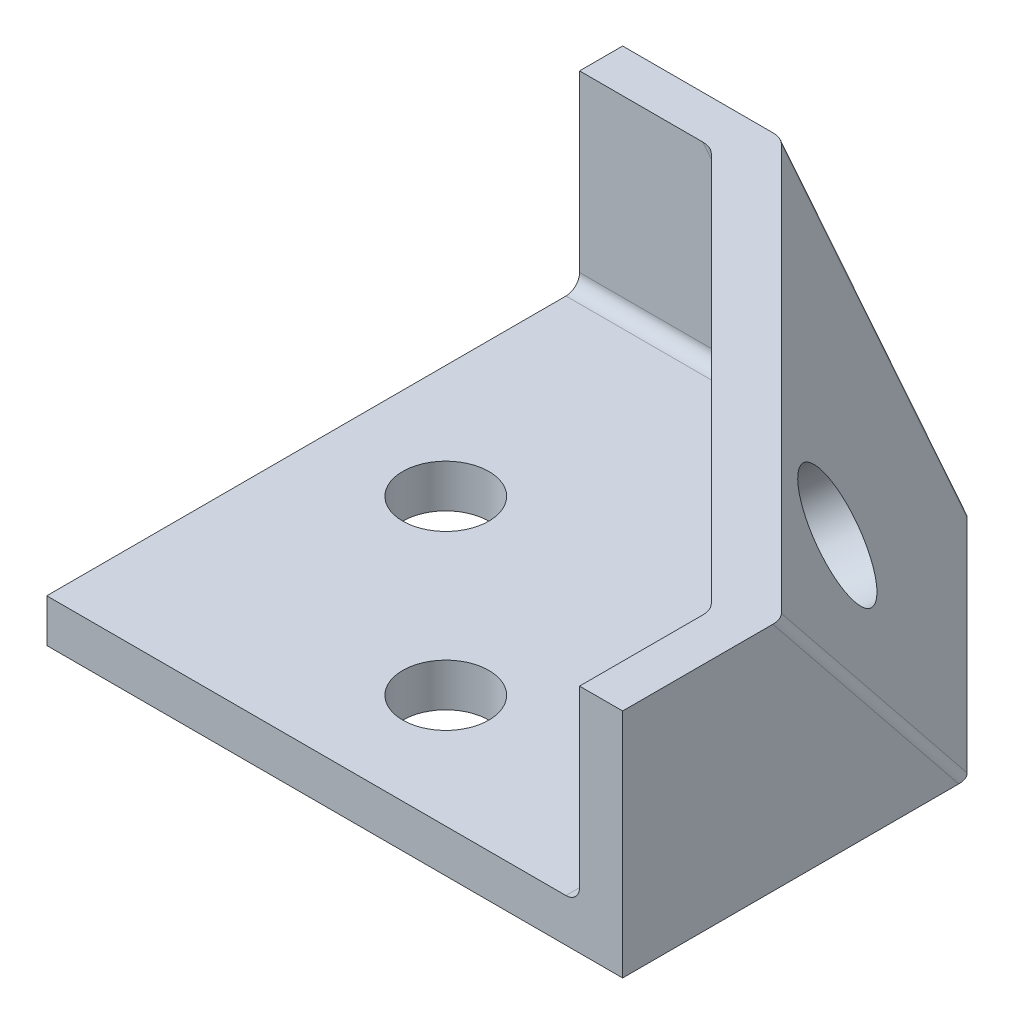
ISO-10303-21;
HEADER;
FILE_DESCRIPTION(('STEP AP214'),'2;1');
FILE_NAME('part.step','',(''),(''),'','','');
FILE_SCHEMA(('AUTOMOTIVE_DESIGN { 1 0 10303 214 1 1 1 1 }'));
ENDSEC;
DATA;
#1=APPLICATION_CONTEXT('core data for automotive mechanical design processes');
#2=APPLICATION_PROTOCOL_DEFINITION('international standard','automotive_design',2000,#1);
#3=PRODUCT_CONTEXT('',#1,'mechanical');
#4=PRODUCT('Part','Part','',(#3));
#5=PRODUCT_RELATED_PRODUCT_CATEGORY('part','',(#4));
#6=PRODUCT_DEFINITION_FORMATION('','',#4);
#7=PRODUCT_DEFINITION_CONTEXT('part definition',#1,'design');
#8=PRODUCT_DEFINITION('design','',#6,#7);
#9=PRODUCT_DEFINITION_SHAPE('','',#8);
#10=(LENGTH_UNIT() NAMED_UNIT(*) SI_UNIT(.MILLI.,.METRE.));
#11=(NAMED_UNIT(*) PLANE_ANGLE_UNIT() SI_UNIT($,.RADIAN.));
#12=(NAMED_UNIT(*) SI_UNIT($,.STERADIAN.) SOLID_ANGLE_UNIT());
#13=UNCERTAINTY_MEASURE_WITH_UNIT(LENGTH_MEASURE(1.E-05),#10,'distance_accuracy_value','');
#14=(GEOMETRIC_REPRESENTATION_CONTEXT(3) GLOBAL_UNCERTAINTY_ASSIGNED_CONTEXT((#13)) GLOBAL_UNIT_ASSIGNED_CONTEXT((#10,
#11,#12)) REPRESENTATION_CONTEXT('',''));
#15=CARTESIAN_POINT('',(0.,0.,0.));
#16=DIRECTION('',(0.,0.,1.));
#17=DIRECTION('',(1.,0.,0.));
#18=AXIS2_PLACEMENT_3D('',#15,#16,#17);
#19=CARTESIAN_POINT('',(-63.5,51.,-63.5));
#20=DIRECTION('',(1.,0.,0.));
#21=DIRECTION('',(0.,0.,-1.));
#22=AXIS2_PLACEMENT_3D('',#19,#20,#21);
#23=PLANE('',#22);
#24=DIRECTION('',(0.,0.,1.));
#25=VECTOR('',#24,1.);
#26=CARTESIAN_POINT('',(-63.5,9.5,-63.5));
#27=LINE('',#26,#25);
#28=CARTESIAN_POINT('',(-63.5,9.5,-51.));
#29=VERTEX_POINT('',#28);
#30=CARTESIAN_POINT('',(-63.5,9.5,63.5));
#31=VERTEX_POINT('',#30);
#32=EDGE_CURVE('E313',#29,#31,#27,.T.);
#33=ORIENTED_EDGE('',*,*,#32,.F.);
#34=CARTESIAN_POINT('',(-63.5,12.5,-51.));
#35=DIRECTION('',(1.,0.,0.));
#36=DIRECTION('',(0.,0.,-1.));
#37=AXIS2_PLACEMENT_3D('',#34,#35,#36);
#38=CIRCLE('',#37,3.);
#39=CARTESIAN_POINT('',(-63.5,12.5,-54.));
#40=VERTEX_POINT('',#39);
#41=EDGE_CURVE('E191',#29,#40,#38,.T.);
#42=ORIENTED_EDGE('',*,*,#41,.T.);
#43=DIRECTION('',(0.,-1.,0.));
#44=VECTOR('',#43,1.);
#45=CARTESIAN_POINT('',(-63.5,51.,-54.));
#46=LINE('',#45,#44);
#47=CARTESIAN_POINT('',(-63.5,51.,-54.));
#48=VERTEX_POINT('',#47);
#49=EDGE_CURVE('E176',#48,#40,#46,.T.);
#50=ORIENTED_EDGE('',*,*,#49,.F.);
#51=DIRECTION('',(0.,0.,1.));
#52=VECTOR('',#51,1.);
#53=CARTESIAN_POINT('',(-63.5,51.,-63.5));
#54=LINE('',#53,#52);
#55=CARTESIAN_POINT('',(-63.5,51.,-63.5));
#56=VERTEX_POINT('',#55);
#57=EDGE_CURVE('E189',#56,#48,#54,.T.);
#58=ORIENTED_EDGE('',*,*,#57,.F.);
#59=DIRECTION('',(0.,-1.,0.));
#60=VECTOR('',#59,1.);
#61=CARTESIAN_POINT('',(-63.5,51.,-63.5));
#62=LINE('',#61,#60);
#63=CARTESIAN_POINT('',(-63.5,0.,-63.5));
#64=VERTEX_POINT('',#63);
#65=EDGE_CURVE('E212',#56,#64,#62,.T.);
#66=ORIENTED_EDGE('',*,*,#65,.T.);
#67=DIRECTION('',(0.,0.,1.));
#68=VECTOR('',#67,1.);
#69=CARTESIAN_POINT('',(-63.5,0.,-63.5));
#70=LINE('',#69,#68);
#71=CARTESIAN_POINT('',(-63.5,0.,63.5));
#72=VERTEX_POINT('',#71);
#73=EDGE_CURVE('E213',#64,#72,#70,.T.);
#74=ORIENTED_EDGE('',*,*,#73,.T.);
#75=DIRECTION('',(0.,-1.,0.));
#76=VECTOR('',#75,1.);
#77=CARTESIAN_POINT('',(-63.5,51.,63.5));
#78=LINE('',#77,#76);
#79=EDGE_CURVE('E223',#31,#72,#78,.T.);
#80=ORIENTED_EDGE('',*,*,#79,.F.);
#81=EDGE_LOOP('',(#33,#42,#50,#58,#66,#74,#80));
#82=FACE_BOUND('',#81,.T.);
#83=ADVANCED_FACE('F62',(#82),#23,.F.);
#84=CARTESIAN_POINT('',(-63.5,51.,63.5));
#85=DIRECTION('',(0.,0.,-1.));
#86=DIRECTION('',(-1.,0.,0.));
#87=AXIS2_PLACEMENT_3D('',#84,#85,#86);
#88=PLANE('',#87);
#89=DIRECTION('',(1.,0.,0.));
#90=VECTOR('',#89,1.);
#91=CARTESIAN_POINT('',(-63.5,9.5,63.5));
#92=LINE('',#91,#90);
#93=CARTESIAN_POINT('',(51.,9.5,63.5));
#94=VERTEX_POINT('',#93);
#95=EDGE_CURVE('E311',#31,#94,#92,.T.);
#96=ORIENTED_EDGE('',*,*,#95,.F.);
#97=ORIENTED_EDGE('',*,*,#79,.T.);
#98=DIRECTION('',(1.,0.,0.));
#99=VECTOR('',#98,1.);
#100=CARTESIAN_POINT('',(-63.5,0.,63.5));
#101=LINE('',#100,#99);
#102=CARTESIAN_POINT('',(63.5,0.,63.5));
#103=VERTEX_POINT('',#102);
#104=EDGE_CURVE('E216',#72,#103,#101,.T.);
#105=ORIENTED_EDGE('',*,*,#104,.T.);
#106=DIRECTION('',(0.,-1.,0.));
#107=VECTOR('',#106,1.);
#108=CARTESIAN_POINT('',(63.5,51.,63.5));
#109=LINE('',#108,#107);
#110=CARTESIAN_POINT('',(63.5,51.,63.5));
#111=VERTEX_POINT('',#110);
#112=EDGE_CURVE('E220',#111,#103,#109,.T.);
#113=ORIENTED_EDGE('',*,*,#112,.F.);
#114=DIRECTION('',(1.,0.,0.));
#115=VECTOR('',#114,1.);
#116=CARTESIAN_POINT('',(-63.5,51.,63.5));
#117=LINE('',#116,#115);
#118=CARTESIAN_POINT('',(54.,51.,63.5));
#119=VERTEX_POINT('',#118);
#120=EDGE_CURVE('E198',#119,#111,#117,.T.);
#121=ORIENTED_EDGE('',*,*,#120,.F.);
#122=DIRECTION('',(0.,-1.,0.));
#123=VECTOR('',#122,1.);
#124=CARTESIAN_POINT('',(54.,51.,63.5));
#125=LINE('',#124,#123);
#126=CARTESIAN_POINT('',(54.,12.5,63.5));
#127=VERTEX_POINT('',#126);
#128=EDGE_CURVE('E192',#119,#127,#125,.T.);
#129=ORIENTED_EDGE('',*,*,#128,.T.);
#130=CARTESIAN_POINT('',(51.,12.5,63.5));
#131=DIRECTION('',(0.,0.,-1.));
#132=DIRECTION('',(-1.,0.,0.));
#133=AXIS2_PLACEMENT_3D('',#130,#131,#132);
#134=CIRCLE('',#133,3.);
#135=EDGE_CURVE('E238',#127,#94,#134,.T.);
#136=ORIENTED_EDGE('',*,*,#135,.T.);
#137=EDGE_LOOP('',(#96,#97,#105,#113,#121,#129,#136));
#138=FACE_BOUND('',#137,.T.);
#139=ADVANCED_FACE('F335',(#138),#88,.F.);
#140=CARTESIAN_POINT('',(63.5,51.,-63.5));
#141=DIRECTION('',(-1.,0.,0.));
#142=DIRECTION('',(0.,0.,1.));
#143=AXIS2_PLACEMENT_3D('',#140,#141,#142);
#144=PLANE('',#143);
#145=DIRECTION('',(0.,0.,-1.));
#146=VECTOR('',#145,1.);
#147=CARTESIAN_POINT('',(63.5,0.,-63.5));
#148=LINE('',#147,#146);
#149=CARTESIAN_POINT('',(63.5,0.,-10.6197736736357));
#150=VERTEX_POINT('',#149);
#151=EDGE_CURVE('E203',#103,#150,#148,.T.);
#152=ORIENTED_EDGE('',*,*,#151,.T.);
#153=DIRECTION('',(0.,-0.779375670806284,-0.62655691182466));
#154=VECTOR('',#153,1.);
#155=CARTESIAN_POINT('',(63.5,50.0818418382933,29.642099176757));
#156=LINE('',#155,#154);
#157=CARTESIAN_POINT('',(63.5,51.,30.3802263263643));
#158=VERTEX_POINT('',#157);
#159=EDGE_CURVE('E270',#150,#158,#156,.F.);
#160=ORIENTED_EDGE('',*,*,#159,.T.);
#161=DIRECTION('',(0.,0.,-1.));
#162=VECTOR('',#161,1.);
#163=CARTESIAN_POINT('',(63.5,51.,-63.5));
#164=LINE('',#163,#162);
#165=EDGE_CURVE('E201',#111,#158,#164,.T.);
#166=ORIENTED_EDGE('',*,*,#165,.F.);
#167=ORIENTED_EDGE('',*,*,#112,.T.);
#168=EDGE_LOOP('',(#152,#160,#166,#167));
#169=FACE_BOUND('',#168,.T.);
#170=ADVANCED_FACE('F331',(#169),#144,.F.);
#171=CARTESIAN_POINT('',(-63.5,51.,-63.5));
#172=DIRECTION('',(0.,0.,1.));
#173=DIRECTION('',(1.,0.,0.));
#174=AXIS2_PLACEMENT_3D('',#171,#172,#173);
#175=PLANE('',#174);
#176=DIRECTION('',(-1.,0.,0.));
#177=VECTOR('',#176,1.);
#178=CARTESIAN_POINT('',(-63.5,51.,-63.5));
#179=LINE('',#178,#177);
#180=CARTESIAN_POINT('',(-30.3802263263644,51.,-63.5));
#181=VERTEX_POINT('',#180);
#182=EDGE_CURVE('E196',#181,#56,#179,.T.);
#183=ORIENTED_EDGE('',*,*,#182,.F.);
#184=DIRECTION('',(-0.62655691182466,0.779375670806284,0.));
#185=VECTOR('',#184,1.);
#186=CARTESIAN_POINT('',(11.3579008232429,-0.918158161706656,-63.5));
#187=LINE('',#186,#185);
#188=CARTESIAN_POINT('',(10.6197736736356,0.,-63.5));
#189=VERTEX_POINT('',#188);
#190=EDGE_CURVE('E87',#181,#189,#187,.F.);
#191=ORIENTED_EDGE('',*,*,#190,.T.);
#192=DIRECTION('',(-1.,0.,0.));
#193=VECTOR('',#192,1.);
#194=CARTESIAN_POINT('',(-63.5,0.,-63.5));
#195=LINE('',#194,#193);
#196=EDGE_CURVE('E199',#189,#64,#195,.T.);
#197=ORIENTED_EDGE('',*,*,#196,.T.);
#198=ORIENTED_EDGE('',*,*,#65,.F.);
#199=EDGE_LOOP('',(#183,#191,#197,#198));
#200=FACE_BOUND('',#199,.T.);
#201=ADVANCED_FACE('F340',(#200),#175,.F.);
#202=CARTESIAN_POINT('',(-63.5,51.,63.5));
#203=DIRECTION('',(0.,1.,0.));
#204=DIRECTION('',(0.,0.,1.));
#205=AXIS2_PLACEMENT_3D('',#202,#203,#204);
#206=PLANE('',#205);
#207=DIRECTION('',(-0.707106781186548,0.,-0.707106781186547));
#208=VECTOR('',#207,1.);
#209=CARTESIAN_POINT('',(17.5,51.,-17.5));
#210=LINE('',#209,#208);
#211=CARTESIAN_POINT('',(62.3441767652003,51.,27.3441767652003));
#212=VERTEX_POINT('',#211);
#213=CARTESIAN_POINT('',(-27.3441767652003,51.,-62.3441767652003));
#214=VERTEX_POINT('',#213);
#215=EDGE_CURVE('E206',#212,#214,#210,.T.);
#216=ORIENTED_EDGE('',*,*,#215,.T.);
#217=CARTESIAN_POINT('',(-30.3802263263644,51.,-60.5));
#218=DIRECTION('',(0.,1.,0.));
#219=DIRECTION('',(1.,0.,0.));
#220=AXIS2_PLACEMENT_3D('',#217,#218,#219);
#221=ELLIPSE('',#220,3.84923485858421,3.);
#222=EDGE_CURVE('E264',#214,#181,#221,.T.);
#223=ORIENTED_EDGE('',*,*,#222,.T.);
#224=ORIENTED_EDGE('',*,*,#182,.T.);
#225=ORIENTED_EDGE('',*,*,#57,.T.);
#226=DIRECTION('',(-1.,0.,0.));
#227=VECTOR('',#226,1.);
#228=CARTESIAN_POINT('',(-63.5,51.,-54.));
#229=LINE('',#228,#227);
#230=CARTESIAN_POINT('',(-36.3342763598515,51.,-54.));
#231=VERTEX_POINT('',#230);
#232=EDGE_CURVE('E172',#231,#48,#229,.T.);
#233=ORIENTED_EDGE('',*,*,#232,.F.);
#234=CARTESIAN_POINT('',(-36.3342763598515,51.,-51.));
#235=DIRECTION('',(0.,1.,0.));
#236=DIRECTION('',(-1.,0.,0.));
#237=AXIS2_PLACEMENT_3D('',#234,#235,#236);
#238=ELLIPSE('',#237,3.84923485858421,3.);
#239=CARTESIAN_POINT('',(-33.2982267986875,51.,-52.8441767652003));
#240=VERTEX_POINT('',#239);
#241=EDGE_CURVE('E44',#231,#240,#238,.F.);
#242=ORIENTED_EDGE('',*,*,#241,.T.);
#243=DIRECTION('',(-0.707106781186548,0.,-0.707106781186547));
#244=VECTOR('',#243,1.);
#245=CARTESIAN_POINT('',(9.77297498325641,51.,-9.77297498325644));
#246=LINE('',#245,#244);
#247=CARTESIAN_POINT('',(52.8441767652003,51.,33.2982267986874));
#248=VERTEX_POINT('',#247);
#249=EDGE_CURVE('E308',#248,#240,#246,.T.);
#250=ORIENTED_EDGE('',*,*,#249,.F.);
#251=CARTESIAN_POINT('',(51.,51.,36.3342763598515));
#252=DIRECTION('',(0.,1.,0.));
#253=DIRECTION('',(0.,0.,-1.));
#254=AXIS2_PLACEMENT_3D('',#251,#252,#253);
#255=ELLIPSE('',#254,3.84923485858421,3.);
#256=CARTESIAN_POINT('',(54.,51.,36.3342763598515));
#257=VERTEX_POINT('',#256);
#258=EDGE_CURVE('E71',#248,#257,#255,.F.);
#259=ORIENTED_EDGE('',*,*,#258,.T.);
#260=DIRECTION('',(0.,0.,-1.));
#261=VECTOR('',#260,1.);
#262=CARTESIAN_POINT('',(54.,51.,-63.5));
#263=LINE('',#262,#261);
#264=EDGE_CURVE('E183',#119,#257,#263,.T.);
#265=ORIENTED_EDGE('',*,*,#264,.F.);
#266=ORIENTED_EDGE('',*,*,#120,.T.);
#267=ORIENTED_EDGE('',*,*,#165,.T.);
#268=CARTESIAN_POINT('',(60.5,51.,30.3802263263643));
#269=DIRECTION('',(0.,1.,0.));
#270=DIRECTION('',(0.,0.,1.));
#271=AXIS2_PLACEMENT_3D('',#268,#269,#270);
#272=ELLIPSE('',#271,3.84923485858421,3.);
#273=EDGE_CURVE('E262',#158,#212,#272,.T.);
#274=ORIENTED_EDGE('',*,*,#273,.T.);
#275=EDGE_LOOP('',(#216,#223,#224,#225,#233,#242,#250,#259,#265,#266,#267,#274));
#276=FACE_BOUND('',#275,.T.);
#277=ADVANCED_FACE('F195',(#276),#206,.T.);
#278=CARTESIAN_POINT('',(-63.5,0.,63.5));
#279=DIRECTION('',(0.,1.,0.));
#280=DIRECTION('',(0.,0.,1.));
#281=AXIS2_PLACEMENT_3D('',#278,#279,#280);
#282=PLANE('',#281);
#283=CARTESIAN_POINT('',(-0.50000000000001,0.,38.5));
#284=DIRECTION('',(0.,1.,0.));
#285=DIRECTION('',(0.,0.,1.));
#286=AXIS2_PLACEMENT_3D('',#283,#284,#285);
#287=CIRCLE('',#286,9.5);
#288=CARTESIAN_POINT('',(-0.50000000000001,0.,48.));
#289=VERTEX_POINT('',#288);
#290=EDGE_CURVE('E289',#289,#289,#287,.T.);
#291=ORIENTED_EDGE('',*,*,#290,.T.);
#292=EDGE_LOOP('',(#291));
#293=FACE_BOUND('',#292,.T.);
#294=CARTESIAN_POINT('',(-38.5,0.,0.5));
#295=DIRECTION('',(0.,1.,0.));
#296=DIRECTION('',(0.,0.,1.));
#297=AXIS2_PLACEMENT_3D('',#294,#295,#296);
#298=CIRCLE('',#297,9.5);
#299=CARTESIAN_POINT('',(-38.5,0.,10.));
#300=VERTEX_POINT('',#299);
#301=EDGE_CURVE('E297',#300,#300,#298,.T.);
#302=ORIENTED_EDGE('',*,*,#301,.T.);
#303=EDGE_LOOP('',(#302));
#304=FACE_BOUND('',#303,.T.);
#305=ORIENTED_EDGE('',*,*,#196,.F.);
#306=CARTESIAN_POINT('',(10.6197736736356,0.,-60.5));
#307=DIRECTION('',(0.,1.,0.));
#308=DIRECTION('',(1.,0.,0.));
#309=AXIS2_PLACEMENT_3D('',#306,#307,#308);
#310=ELLIPSE('',#309,3.84923485858421,3.);
#311=CARTESIAN_POINT('',(13.6558232347997,0.,-62.3441767652003));
#312=VERTEX_POINT('',#311);
#313=EDGE_CURVE('E268',#189,#312,#310,.F.);
#314=ORIENTED_EDGE('',*,*,#313,.T.);
#315=DIRECTION('',(-0.707106781186548,0.,-0.707106781186547));
#316=VECTOR('',#315,1.);
#317=CARTESIAN_POINT('',(38.,0.,-38.));
#318=LINE('',#317,#316);
#319=CARTESIAN_POINT('',(62.3441767652003,0.,-13.6558232347997));
#320=VERTEX_POINT('',#319);
#321=EDGE_CURVE('E225',#320,#312,#318,.T.);
#322=ORIENTED_EDGE('',*,*,#321,.F.);
#323=CARTESIAN_POINT('',(60.5,0.,-10.6197736736357));
#324=DIRECTION('',(0.,1.,0.));
#325=DIRECTION('',(0.,0.,1.));
#326=AXIS2_PLACEMENT_3D('',#323,#324,#325);
#327=ELLIPSE('',#326,3.84923485858421,3.);
#328=EDGE_CURVE('E79',#320,#150,#327,.F.);
#329=ORIENTED_EDGE('',*,*,#328,.T.);
#330=ORIENTED_EDGE('',*,*,#151,.F.);
#331=ORIENTED_EDGE('',*,*,#104,.F.);
#332=ORIENTED_EDGE('',*,*,#73,.F.);
#333=EDGE_LOOP('',(#305,#314,#322,#329,#330,#331,#332));
#334=FACE_BOUND('',#333,.T.);
#335=ADVANCED_FACE('F337',(#293,#304,#334),#282,.F.);
#336=CARTESIAN_POINT('',(28.7194537265727,23.0881882899898,-28.7194537265727));
#337=DIRECTION('',(0.614725588400102,0.494191159302043,-0.614725588400102));
#338=DIRECTION('',(-0.707106781186548,0.,-0.707106781186547));
#339=AXIS2_PLACEMENT_3D('',#336,#337,#338);
#340=PLANE('',#339);
#341=CARTESIAN_POINT('',(38.2602862577775,35.6434838343814,-9.08514830673944));
#342=DIRECTION('',(0.614725588400102,0.494191159302043,-0.614725588400102));
#343=DIRECTION('',(-0.707106781186548,0.,-0.707106781186547));
#344=AXIS2_PLACEMENT_3D('',#341,#342,#343);
#345=CIRCLE('',#344,12.5);
#346=CARTESIAN_POINT('',(29.4214514929456,35.6434838343814,-17.9239830715713));
#347=VERTEX_POINT('',#346);
#348=EDGE_CURVE('E300',#347,#347,#345,.T.);
#349=ORIENTED_EDGE('',*,*,#348,.F.);
#350=EDGE_LOOP('',(#349));
#351=FACE_BOUND('',#350,.T.);
#352=ORIENTED_EDGE('',*,*,#321,.T.);
#353=DIRECTION('',(-0.62655691182466,0.779375670806284,0.));
#354=VECTOR('',#353,1.);
#355=CARTESIAN_POINT('',(-27.7979224115567,51.5644153161995,-62.3441767652003));
#356=LINE('',#355,#354);
#357=EDGE_CURVE('E259',#312,#214,#356,.T.);
#358=ORIENTED_EDGE('',*,*,#357,.T.);
#359=ORIENTED_EDGE('',*,*,#215,.F.);
#360=DIRECTION('',(0.,-0.779375670806284,-0.62655691182466));
#361=VECTOR('',#360,1.);
#362=CARTESIAN_POINT('',(62.3441767652003,0.56441531619948,-13.2020775884433));
#363=LINE('',#362,#361);
#364=EDGE_CURVE('E256',#212,#320,#363,.T.);
#365=ORIENTED_EDGE('',*,*,#364,.T.);
#366=EDGE_LOOP('',(#352,#358,#359,#365));
#367=FACE_BOUND('',#366,.T.);
#368=ADVANCED_FACE('F325',(#351,#367),#340,.T.);
#369=CARTESIAN_POINT('',(54.,51.,-63.5));
#370=DIRECTION('',(-1.,0.,0.));
#371=DIRECTION('',(0.,0.,1.));
#372=AXIS2_PLACEMENT_3D('',#369,#370,#371);
#373=PLANE('',#372);
#374=ORIENTED_EDGE('',*,*,#264,.T.);
#375=DIRECTION('',(0.,-0.779375670806284,-0.62655691182466));
#376=VECTOR('',#375,1.);
#377=CARTESIAN_POINT('',(54.,2.24860535533641,-2.85802129566238));
#378=LINE('',#377,#376);
#379=CARTESIAN_POINT('',(54.,12.5,5.38329596769462));
#380=VERTEX_POINT('',#379);
#381=EDGE_CURVE('E240',#257,#380,#378,.T.);
#382=ORIENTED_EDGE('',*,*,#381,.T.);
#383=DIRECTION('',(0.,0.,-1.));
#384=VECTOR('',#383,1.);
#385=CARTESIAN_POINT('',(54.,12.5,63.5));
#386=LINE('',#385,#384);
#387=EDGE_CURVE('E235',#380,#127,#386,.F.);
#388=ORIENTED_EDGE('',*,*,#387,.T.);
#389=ORIENTED_EDGE('',*,*,#128,.F.);
#390=EDGE_LOOP('',(#374,#382,#388,#389));
#391=FACE_BOUND('',#390,.T.);
#392=ADVANCED_FACE('F397',(#391),#373,.T.);
#393=CARTESIAN_POINT('',(-63.5,51.,-54.));
#394=DIRECTION('',(0.,0.,1.));
#395=DIRECTION('',(1.,0.,0.));
#396=AXIS2_PLACEMENT_3D('',#393,#394,#395);
#397=PLANE('',#396);
#398=DIRECTION('',(-1.,0.,0.));
#399=VECTOR('',#398,1.);
#400=CARTESIAN_POINT('',(-1.09130493544793,12.5,-54.));
#401=LINE('',#400,#399);
#402=CARTESIAN_POINT('',(-5.38329596769465,12.5,-54.));
#403=VERTEX_POINT('',#402);
#404=EDGE_CURVE('E233',#40,#403,#401,.F.);
#405=ORIENTED_EDGE('',*,*,#404,.T.);
#406=DIRECTION('',(-0.62655691182466,0.779375670806284,0.));
#407=VECTOR('',#406,1.);
#408=CARTESIAN_POINT('',(-46.998821301255,64.265653463697,-54.));
#409=LINE('',#408,#407);
#410=EDGE_CURVE('E179',#403,#231,#409,.T.);
#411=ORIENTED_EDGE('',*,*,#410,.T.);
#412=ORIENTED_EDGE('',*,*,#232,.T.);
#413=ORIENTED_EDGE('',*,*,#49,.T.);
#414=EDGE_LOOP('',(#405,#411,#412,#413));
#415=FACE_BOUND('',#414,.T.);
#416=ADVANCED_FACE('F175',(#415),#397,.T.);
#417=CARTESIAN_POINT('',(-63.5,9.5,63.5));
#418=DIRECTION('',(0.,1.,0.));
#419=DIRECTION('',(0.,0.,1.));
#420=AXIS2_PLACEMENT_3D('',#417,#418,#419);
#421=PLANE('',#420);
#422=CARTESIAN_POINT('',(-0.50000000000001,9.5,38.5));
#423=DIRECTION('',(0.,1.,0.));
#424=DIRECTION('',(0.,0.,1.));
#425=AXIS2_PLACEMENT_3D('',#422,#423,#424);
#426=CIRCLE('',#425,9.5);
#427=CARTESIAN_POINT('',(-0.50000000000001,9.5,48.));
#428=VERTEX_POINT('',#427);
#429=EDGE_CURVE('E284',#428,#428,#426,.T.);
#430=ORIENTED_EDGE('',*,*,#429,.F.);
#431=EDGE_LOOP('',(#430));
#432=FACE_BOUND('',#431,.T.);
#433=CARTESIAN_POINT('',(-38.5,9.5,0.5));
#434=DIRECTION('',(0.,1.,0.));
#435=DIRECTION('',(0.,0.,1.));
#436=AXIS2_PLACEMENT_3D('',#433,#434,#435);
#437=CIRCLE('',#436,9.5);
#438=CARTESIAN_POINT('',(-38.5,9.5,10.));
#439=VERTEX_POINT('',#438);
#440=EDGE_CURVE('E294',#439,#439,#437,.T.);
#441=ORIENTED_EDGE('',*,*,#440,.F.);
#442=EDGE_LOOP('',(#441));
#443=FACE_BOUND('',#442,.T.);
#444=DIRECTION('',(0.,0.,-1.));
#445=VECTOR('',#444,1.);
#446=CARTESIAN_POINT('',(51.,9.5,1.09130493544791));
#447=LINE('',#446,#445);
#448=CARTESIAN_POINT('',(51.,9.5,5.38329596769462));
#449=VERTEX_POINT('',#448);
#450=EDGE_CURVE('E228',#94,#449,#447,.T.);
#451=ORIENTED_EDGE('',*,*,#450,.T.);
#452=DIRECTION('',(-0.707106781186548,0.,-0.707106781186547));
#453=VECTOR('',#452,1.);
#454=CARTESIAN_POINT('',(22.8083520161527,9.5,-22.8083520161527));
#455=LINE('',#454,#453);
#456=CARTESIAN_POINT('',(-5.38329596769464,9.5,-51.));
#457=VERTEX_POINT('',#456);
#458=EDGE_CURVE('E251',#449,#457,#455,.T.);
#459=ORIENTED_EDGE('',*,*,#458,.T.);
#460=DIRECTION('',(-1.,0.,0.));
#461=VECTOR('',#460,1.);
#462=CARTESIAN_POINT('',(-63.5,9.5,-51.));
#463=LINE('',#462,#461);
#464=EDGE_CURVE('E231',#457,#29,#463,.T.);
#465=ORIENTED_EDGE('',*,*,#464,.T.);
#466=ORIENTED_EDGE('',*,*,#32,.T.);
#467=ORIENTED_EDGE('',*,*,#95,.T.);
#468=EDGE_LOOP('',(#451,#459,#465,#466,#467));
#469=FACE_BOUND('',#468,.T.);
#470=ADVANCED_FACE('F399',(#432,#443,#469),#421,.T.);
#471=CARTESIAN_POINT('',(22.8795606367717,18.3933722766204,-22.8795606367717));
#472=DIRECTION('',(0.614725588400102,0.494191159302043,-0.614725588400102));
#473=DIRECTION('',(-0.707106781186548,0.,-0.707106781186547));
#474=AXIS2_PLACEMENT_3D('',#471,#472,#473);
#475=PLANE('',#474);
#476=CARTESIAN_POINT('',(32.4203931679765,30.948667821012,-3.24525521693847));
#477=DIRECTION('',(0.614725588400102,0.494191159302043,-0.614725588400102));
#478=DIRECTION('',(-0.707106781186548,0.,-0.707106781186547));
#479=AXIS2_PLACEMENT_3D('',#476,#477,#478);
#480=CIRCLE('',#479,12.5);
#481=CARTESIAN_POINT('',(23.5815584031447,30.948667821012,-12.0840899817703));
#482=VERTEX_POINT('',#481);
#483=EDGE_CURVE('E305',#482,#482,#480,.F.);
#484=ORIENTED_EDGE('',*,*,#483,.F.);
#485=EDGE_LOOP('',(#484));
#486=FACE_BOUND('',#485,.T.);
#487=DIRECTION('',(-0.707106781186548,0.,-0.707106781186547));
#488=VECTOR('',#487,1.);
#489=CARTESIAN_POINT('',(24.652528781353,13.9825734779061,-24.652528781353));
#490=LINE('',#489,#488);
#491=CARTESIAN_POINT('',(-3.53911920249434,13.9825734779061,-52.8441767652003));
#492=VERTEX_POINT('',#491);
#493=CARTESIAN_POINT('',(52.8441767652003,13.9825734779061,3.53911920249431));
#494=VERTEX_POINT('',#493);
#495=EDGE_CURVE('E245',#492,#494,#490,.F.);
#496=ORIENTED_EDGE('',*,*,#495,.T.);
#497=DIRECTION('',(0.,-0.779375670806284,-0.62655691182466));
#498=VECTOR('',#497,1.);
#499=CARTESIAN_POINT('',(52.8441767652003,3.76095463894081,-4.67826064843858));
#500=LINE('',#499,#498);
#501=EDGE_CURVE('E247',#494,#248,#500,.F.);
#502=ORIENTED_EDGE('',*,*,#501,.T.);
#503=ORIENTED_EDGE('',*,*,#249,.T.);
#504=DIRECTION('',(-0.62655691182466,0.779375670806284,0.));
#505=VECTOR('',#504,1.);
#506=CARTESIAN_POINT('',(4.67826064843857,3.7609546389408,-52.8441767652003));
#507=LINE('',#506,#505);
#508=EDGE_CURVE('E243',#240,#492,#507,.F.);
#509=ORIENTED_EDGE('',*,*,#508,.T.);
#510=EDGE_LOOP('',(#496,#502,#503,#509));
#511=FACE_BOUND('',#510,.T.);
#512=ADVANCED_FACE('F388',(#486,#511),#475,.F.);
#513=CARTESIAN_POINT('',(-38.4519457631436,-26.0271340647905,67.6270837141817));
#514=DIRECTION('',(0.614725588400102,0.494191159302043,-0.614725588400102));
#515=DIRECTION('',(-0.707106781186548,0.,-0.707106781186547));
#516=AXIS2_PLACEMENT_3D('',#513,#514,#515);
#517=CYLINDRICAL_SURFACE('',#516,12.5);
#518=ORIENTED_EDGE('',*,*,#348,.T.);
#519=EDGE_LOOP('',(#518));
#520=FACE_BOUND('',#519,.T.);
#521=ORIENTED_EDGE('',*,*,#483,.T.);
#522=EDGE_LOOP('',(#521));
#523=FACE_BOUND('',#522,.T.);
#524=ADVANCED_FACE('F408',(#520,#523),#517,.F.);
#525=CARTESIAN_POINT('',(-38.5,0.,0.5));
#526=DIRECTION('',(0.,1.,0.));
#527=DIRECTION('',(0.,0.,1.));
#528=AXIS2_PLACEMENT_3D('',#525,#526,#527);
#529=CYLINDRICAL_SURFACE('',#528,9.5);
#530=ORIENTED_EDGE('',*,*,#301,.F.);
#531=EDGE_LOOP('',(#530));
#532=FACE_BOUND('',#531,.T.);
#533=ORIENTED_EDGE('',*,*,#440,.T.);
#534=EDGE_LOOP('',(#533));
#535=FACE_BOUND('',#534,.T.);
#536=ADVANCED_FACE('F529',(#532,#535),#529,.F.);
#537=CARTESIAN_POINT('',(-0.50000000000001,0.,38.5));
#538=DIRECTION('',(0.,1.,0.));
#539=DIRECTION('',(0.,0.,1.));
#540=AXIS2_PLACEMENT_3D('',#537,#538,#539);
#541=CYLINDRICAL_SURFACE('',#540,9.5);
#542=ORIENTED_EDGE('',*,*,#290,.F.);
#543=EDGE_LOOP('',(#542));
#544=FACE_BOUND('',#543,.T.);
#545=ORIENTED_EDGE('',*,*,#429,.T.);
#546=EDGE_LOOP('',(#545));
#547=FACE_BOUND('',#546,.T.);
#548=ADVANCED_FACE('F366',(#544,#547),#541,.F.);
#549=CARTESIAN_POINT('',(-63.5,12.5,-51.));
#550=DIRECTION('',(1.,0.,0.));
#551=DIRECTION('',(0.,0.,-1.));
#552=AXIS2_PLACEMENT_3D('',#549,#550,#551);
#553=CYLINDRICAL_SURFACE('',#552,3.);
#554=ORIENTED_EDGE('',*,*,#464,.F.);
#555=CARTESIAN_POINT('',(-5.38329596769464,12.5,-51.));
#556=DIRECTION('',(1.,0.,0.));
#557=DIRECTION('',(0.,0.,-1.));
#558=AXIS2_PLACEMENT_3D('',#555,#556,#557);
#559=CIRCLE('',#558,3.);
#560=EDGE_CURVE('E253',#457,#403,#559,.T.);
#561=ORIENTED_EDGE('',*,*,#560,.T.);
#562=ORIENTED_EDGE('',*,*,#404,.F.);
#563=ORIENTED_EDGE('',*,*,#41,.F.);
#564=EDGE_LOOP('',(#554,#561,#562,#563));
#565=FACE_BOUND('',#564,.T.);
#566=ADVANCED_FACE('F362',(#565),#553,.F.);
#567=CARTESIAN_POINT('',(51.,12.5,63.5));
#568=DIRECTION('',(0.,0.,1.));
#569=DIRECTION('',(1.,0.,0.));
#570=AXIS2_PLACEMENT_3D('',#567,#568,#569);
#571=CYLINDRICAL_SURFACE('',#570,3.);
#572=ORIENTED_EDGE('',*,*,#387,.F.);
#573=CARTESIAN_POINT('',(51.,12.5,5.38329596769462));
#574=DIRECTION('',(0.,0.,1.));
#575=DIRECTION('',(1.,0.,0.));
#576=AXIS2_PLACEMENT_3D('',#573,#574,#575);
#577=CIRCLE('',#576,3.);
#578=EDGE_CURVE('E249',#380,#449,#577,.F.);
#579=ORIENTED_EDGE('',*,*,#578,.T.);
#580=ORIENTED_EDGE('',*,*,#450,.F.);
#581=ORIENTED_EDGE('',*,*,#135,.F.);
#582=EDGE_LOOP('',(#572,#579,#580,#581));
#583=FACE_BOUND('',#582,.T.);
#584=ADVANCED_FACE('F365',(#583),#571,.F.);
#585=CARTESIAN_POINT('',(-46.998821301255,64.265653463697,-51.));
#586=DIRECTION('',(-0.62655691182466,0.779375670806284,0.));
#587=DIRECTION('',(-0.779375670806284,-0.62655691182466,0.));
#588=AXIS2_PLACEMENT_3D('',#585,#586,#587);
#589=CYLINDRICAL_SURFACE('',#588,3.);
#590=ORIENTED_EDGE('',*,*,#241,.F.);
#591=ORIENTED_EDGE('',*,*,#410,.F.);
#592=CARTESIAN_POINT('',(-5.38329596769464,12.5,-51.));
#593=DIRECTION('',(-0.62655691182466,0.779375670806284,0.));
#594=DIRECTION('',(-0.779375670806284,-0.62655691182466,0.));
#595=AXIS2_PLACEMENT_3D('',#592,#593,#594);
#596=CIRCLE('',#595,3.);
#597=EDGE_CURVE('E66',#492,#403,#596,.T.);
#598=ORIENTED_EDGE('',*,*,#597,.F.);
#599=ORIENTED_EDGE('',*,*,#508,.F.);
#600=EDGE_LOOP('',(#590,#591,#598,#599));
#601=FACE_BOUND('',#600,.T.);
#602=ADVANCED_FACE('F369',(#601),#589,.F.);
#603=CARTESIAN_POINT('',(-5.38329596769464,12.5,-51.));
#604=DIRECTION('',(0.,0.,1.));
#605=DIRECTION('',(1.,0.,0.));
#606=AXIS2_PLACEMENT_3D('',#603,#604,#605);
#607=SPHERICAL_SURFACE('',#606,3.);
#608=ORIENTED_EDGE('',*,*,#597,.T.);
#609=ORIENTED_EDGE('',*,*,#560,.F.);
#610=CARTESIAN_POINT('',(-5.38329596769464,12.5,-51.));
#611=DIRECTION('',(-0.707106781186549,0.,-0.707106781186546));
#612=DIRECTION('',(-0.707106781186546,0.,0.707106781186549));
#613=AXIS2_PLACEMENT_3D('',#610,#611,#612);
#614=CIRCLE('',#613,3.);
#615=EDGE_CURVE('E277',#492,#457,#614,.T.);
#616=ORIENTED_EDGE('',*,*,#615,.F.);
#617=EDGE_LOOP('',(#608,#609,#616));
#618=FACE_BOUND('',#617,.T.);
#619=ADVANCED_FACE('F378',(#618),#607,.F.);
#620=CARTESIAN_POINT('',(22.8083520161527,12.5,-22.8083520161527));
#621=DIRECTION('',(-0.707106781186548,0.,-0.707106781186547));
#622=DIRECTION('',(-0.707106781186547,0.,0.707106781186548));
#623=AXIS2_PLACEMENT_3D('',#620,#621,#622);
#624=CYLINDRICAL_SURFACE('',#623,3.);
#625=ORIENTED_EDGE('',*,*,#615,.T.);
#626=ORIENTED_EDGE('',*,*,#458,.F.);
#627=CARTESIAN_POINT('',(51.,12.5,5.38329596769462));
#628=DIRECTION('',(-0.707106781186547,0.,-0.707106781186549));
#629=DIRECTION('',(-0.707106781186549,0.,0.707106781186547));
#630=AXIS2_PLACEMENT_3D('',#627,#628,#629);
#631=CIRCLE('',#630,3.);
#632=EDGE_CURVE('E275',#494,#449,#631,.T.);
#633=ORIENTED_EDGE('',*,*,#632,.F.);
#634=ORIENTED_EDGE('',*,*,#495,.F.);
#635=EDGE_LOOP('',(#625,#626,#633,#634));
#636=FACE_BOUND('',#635,.T.);
#637=ADVANCED_FACE('F374',(#636),#624,.F.);
#638=CARTESIAN_POINT('',(51.,12.5,5.38329596769462));
#639=DIRECTION('',(0.,0.,1.));
#640=DIRECTION('',(1.,0.,0.));
#641=AXIS2_PLACEMENT_3D('',#638,#639,#640);
#642=SPHERICAL_SURFACE('',#641,3.);
#643=ORIENTED_EDGE('',*,*,#632,.T.);
#644=ORIENTED_EDGE('',*,*,#578,.F.);
#645=CARTESIAN_POINT('',(51.,12.5,5.38329596769462));
#646=DIRECTION('',(0.,-0.779375670806285,-0.626556911824659));
#647=DIRECTION('',(0.,0.626556911824659,-0.779375670806285));
#648=AXIS2_PLACEMENT_3D('',#645,#646,#647);
#649=CIRCLE('',#648,3.);
#650=EDGE_CURVE('E273',#494,#380,#649,.T.);
#651=ORIENTED_EDGE('',*,*,#650,.F.);
#652=EDGE_LOOP('',(#643,#644,#651));
#653=FACE_BOUND('',#652,.T.);
#654=ADVANCED_FACE('F350',(#653),#642,.F.);
#655=CARTESIAN_POINT('',(51.,2.24860535533641,-2.85802129566238));
#656=DIRECTION('',(0.,-0.779375670806284,-0.62655691182466));
#657=DIRECTION('',(0.,0.62655691182466,-0.779375670806284));
#658=AXIS2_PLACEMENT_3D('',#655,#656,#657);
#659=CYLINDRICAL_SURFACE('',#658,3.);
#660=ORIENTED_EDGE('',*,*,#258,.F.);
#661=ORIENTED_EDGE('',*,*,#501,.F.);
#662=ORIENTED_EDGE('',*,*,#650,.T.);
#663=ORIENTED_EDGE('',*,*,#381,.F.);
#664=EDGE_LOOP('',(#660,#661,#662,#663));
#665=FACE_BOUND('',#664,.T.);
#666=ADVANCED_FACE('F345',(#665),#659,.F.);
#667=CARTESIAN_POINT('',(6.45073127630226,5.18588200643907,-60.5));
#668=DIRECTION('',(0.62655691182466,-0.779375670806284,0.));
#669=DIRECTION('',(0.779375670806284,0.62655691182466,0.));
#670=AXIS2_PLACEMENT_3D('',#667,#668,#669);
#671=CYLINDRICAL_SURFACE('',#670,3.);
#672=ORIENTED_EDGE('',*,*,#313,.F.);
#673=ORIENTED_EDGE('',*,*,#190,.F.);
#674=ORIENTED_EDGE('',*,*,#222,.F.);
#675=ORIENTED_EDGE('',*,*,#357,.F.);
#676=EDGE_LOOP('',(#672,#673,#674,#675));
#677=FACE_BOUND('',#676,.T.);
#678=ADVANCED_FACE('F343',(#677),#671,.T.);
#679=CARTESIAN_POINT('',(60.5,5.18588200643908,-6.45073127630228));
#680=DIRECTION('',(0.,0.779375670806284,0.62655691182466));
#681=DIRECTION('',(0.,-0.62655691182466,0.779375670806284));
#682=AXIS2_PLACEMENT_3D('',#679,#680,#681);
#683=CYLINDRICAL_SURFACE('',#682,3.);
#684=ORIENTED_EDGE('',*,*,#273,.F.);
#685=ORIENTED_EDGE('',*,*,#159,.F.);
#686=ORIENTED_EDGE('',*,*,#328,.F.);
#687=ORIENTED_EDGE('',*,*,#364,.F.);
#688=EDGE_LOOP('',(#684,#685,#686,#687));
#689=FACE_BOUND('',#688,.T.);
#690=ADVANCED_FACE('F64',(#689),#683,.T.);
#691=CLOSED_SHELL('',(#83,#139,#170,#201,#277,#335,#368,#392,#416,#470,#512,#524,#536,#548,#566,
#584,#602,#619,#637,#654,#666,#678,#690));
#692=MANIFOLD_SOLID_BREP('B6',#691);
#693=ADVANCED_BREP_SHAPE_REPRESENTATION('',(#18,#692),#14);
#694=SHAPE_DEFINITION_REPRESENTATION(#9,#693);
ENDSEC;
END-ISO-10303-21;
